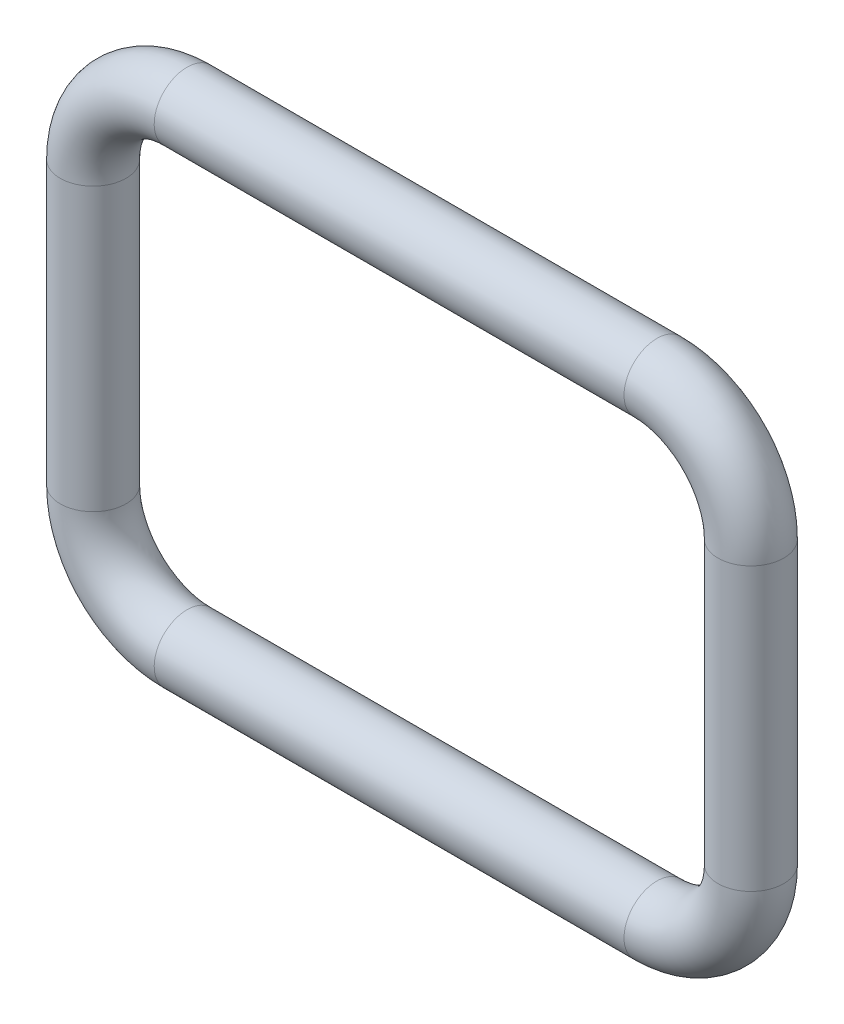
ISO-10303-21;
HEADER;
FILE_DESCRIPTION(('STEP AP214'),'2;1');
FILE_NAME('part.step','',(''),(''),'','','');
FILE_SCHEMA(('AUTOMOTIVE_DESIGN { 1 0 10303 214 1 1 1 1 }'));
ENDSEC;
DATA;
#1=APPLICATION_CONTEXT('core data for automotive mechanical design processes');
#2=APPLICATION_PROTOCOL_DEFINITION('international standard','automotive_design',2000,#1);
#3=PRODUCT_CONTEXT('',#1,'mechanical');
#4=PRODUCT('Part','Part','',(#3));
#5=PRODUCT_RELATED_PRODUCT_CATEGORY('part','',(#4));
#6=PRODUCT_DEFINITION_FORMATION('','',#4);
#7=PRODUCT_DEFINITION_CONTEXT('part definition',#1,'design');
#8=PRODUCT_DEFINITION('design','',#6,#7);
#9=PRODUCT_DEFINITION_SHAPE('','',#8);
#10=(LENGTH_UNIT() NAMED_UNIT(*) SI_UNIT(.MILLI.,.METRE.));
#11=(NAMED_UNIT(*) PLANE_ANGLE_UNIT() SI_UNIT($,.RADIAN.));
#12=(NAMED_UNIT(*) SI_UNIT($,.STERADIAN.) SOLID_ANGLE_UNIT());
#13=UNCERTAINTY_MEASURE_WITH_UNIT(LENGTH_MEASURE(1.E-05),#10,'distance_accuracy_value','');
#14=(GEOMETRIC_REPRESENTATION_CONTEXT(3) GLOBAL_UNCERTAINTY_ASSIGNED_CONTEXT((#13)) GLOBAL_UNIT_ASSIGNED_CONTEXT((#10,
#11,#12)) REPRESENTATION_CONTEXT('',''));
#15=CARTESIAN_POINT('',(0.,0.,0.));
#16=DIRECTION('',(0.,0.,1.));
#17=DIRECTION('',(1.,0.,0.));
#18=AXIS2_PLACEMENT_3D('',#15,#16,#17);
#19=CARTESIAN_POINT('',(-2.61538461538461,1.,0.));
#20=DIRECTION('',(0.,0.,-1.));
#21=DIRECTION('',(-1.,0.,0.));
#22=AXIS2_PLACEMENT_3D('',#19,#20,#21);
#23=TOROIDAL_SURFACE('',#22,1.,0.35);
#24=CARTESIAN_POINT('',(-2.6153846153846,0.,0.));
#25=DIRECTION('',(1.,0.,0.));
#26=DIRECTION('',(0.,1.,0.));
#27=AXIS2_PLACEMENT_3D('',#24,#25,#26);
#28=CIRCLE('',#27,0.35);
#29=CARTESIAN_POINT('',(-2.6153846153846,-0.35,0.));
#30=VERTEX_POINT('',#29);
#31=EDGE_CURVE('E76',#30,#30,#28,.T.);
#32=CARTESIAN_POINT('',(-3.61538461538461,1.00000000000001,0.));
#33=DIRECTION('',(0.,-1.,0.));
#34=DIRECTION('',(1.,0.,0.));
#35=AXIS2_PLACEMENT_3D('',#32,#33,#34);
#36=CIRCLE('',#35,0.35);
#37=CARTESIAN_POINT('',(-3.96538461538461,1.00000000000001,0.));
#38=VERTEX_POINT('',#37);
#39=EDGE_CURVE('E73',#38,#38,#36,.T.);
#40=CARTESIAN_POINT('',(-2.61538461538461,1.,0.));
#41=DIRECTION('',(0.,0.,-1.));
#42=DIRECTION('',(-1.,0.,0.));
#43=AXIS2_PLACEMENT_3D('',#40,#41,#42);
#44=CIRCLE('',#43,1.35);
#45=EDGE_CURVE('',#30,#38,#44,.T.);
#46=ORIENTED_EDGE('',*,*,#31,.F.);
#47=ORIENTED_EDGE('',*,*,#39,.T.);
#48=ORIENTED_EDGE('',*,*,#45,.T.);
#49=ORIENTED_EDGE('',*,*,#45,.F.);
#50=EDGE_LOOP('',(#46,#48,#47,#49));
#51=FACE_BOUND('',#50,.T.);
#52=ADVANCED_FACE('F47',(#51),#23,.T.);
#53=CARTESIAN_POINT('',(-3.61538461538461,1.00000000000001,0.));
#54=DIRECTION('',(0.,1.,0.));
#55=DIRECTION('',(0.,0.,1.));
#56=AXIS2_PLACEMENT_3D('',#53,#54,#55);
#57=CYLINDRICAL_SURFACE('',#56,0.35);
#58=CARTESIAN_POINT('',(-3.61538461538461,3.99999999999999,0.));
#59=DIRECTION('',(0.,-1.,0.));
#60=DIRECTION('',(1.,0.,0.));
#61=AXIS2_PLACEMENT_3D('',#58,#59,#60);
#62=CIRCLE('',#61,0.35);
#63=CARTESIAN_POINT('',(-3.96538461538461,3.99999999999999,0.));
#64=VERTEX_POINT('',#63);
#65=EDGE_CURVE('E70',#64,#64,#62,.T.);
#66=ORIENTED_EDGE('',*,*,#65,.T.);
#67=EDGE_LOOP('',(#66));
#68=FACE_BOUND('',#67,.T.);
#69=ORIENTED_EDGE('',*,*,#39,.F.);
#70=EDGE_LOOP('',(#69));
#71=FACE_BOUND('',#70,.T.);
#72=ADVANCED_FACE('F83',(#68,#71),#57,.T.);
#73=CARTESIAN_POINT('',(-2.61538461538461,4.,0.));
#74=DIRECTION('',(0.,0.,-1.));
#75=DIRECTION('',(-1.,0.,0.));
#76=AXIS2_PLACEMENT_3D('',#73,#74,#75);
#77=TOROIDAL_SURFACE('',#76,1.,0.35);
#78=CARTESIAN_POINT('',(-2.6153846153846,5.,0.));
#79=DIRECTION('',(-1.,0.,0.));
#80=DIRECTION('',(0.,-1.,0.));
#81=AXIS2_PLACEMENT_3D('',#78,#79,#80);
#82=CIRCLE('',#81,0.35);
#83=CARTESIAN_POINT('',(-2.6153846153846,5.35,0.));
#84=VERTEX_POINT('',#83);
#85=EDGE_CURVE('E67',#84,#84,#82,.T.);
#86=CARTESIAN_POINT('',(-2.61538461538461,4.,0.));
#87=DIRECTION('',(0.,0.,-1.));
#88=DIRECTION('',(-1.,0.,0.));
#89=AXIS2_PLACEMENT_3D('',#86,#87,#88);
#90=CIRCLE('',#89,1.35);
#91=EDGE_CURVE('',#64,#84,#90,.T.);
#92=ORIENTED_EDGE('',*,*,#65,.F.);
#93=ORIENTED_EDGE('',*,*,#85,.T.);
#94=ORIENTED_EDGE('',*,*,#91,.T.);
#95=ORIENTED_EDGE('',*,*,#91,.F.);
#96=EDGE_LOOP('',(#92,#94,#93,#95));
#97=FACE_BOUND('',#96,.T.);
#98=ADVANCED_FACE('F89',(#97),#77,.T.);
#99=CARTESIAN_POINT('',(-2.6153846153846,5.,0.));
#100=DIRECTION('',(1.,0.,0.));
#101=DIRECTION('',(0.,0.,-1.));
#102=AXIS2_PLACEMENT_3D('',#99,#100,#101);
#103=CYLINDRICAL_SURFACE('',#102,0.35);
#104=CARTESIAN_POINT('',(2.38461538461538,5.,0.));
#105=DIRECTION('',(-1.,0.,0.));
#106=DIRECTION('',(0.,-1.,0.));
#107=AXIS2_PLACEMENT_3D('',#104,#105,#106);
#108=CIRCLE('',#107,0.35);
#109=CARTESIAN_POINT('',(2.38461538461538,5.35,0.));
#110=VERTEX_POINT('',#109);
#111=EDGE_CURVE('E62',#110,#110,#108,.T.);
#112=ORIENTED_EDGE('',*,*,#111,.T.);
#113=EDGE_LOOP('',(#112));
#114=FACE_BOUND('',#113,.T.);
#115=ORIENTED_EDGE('',*,*,#85,.F.);
#116=EDGE_LOOP('',(#115));
#117=FACE_BOUND('',#116,.T.);
#118=ADVANCED_FACE('F95',(#114,#117),#103,.T.);
#119=CARTESIAN_POINT('',(2.38461538461539,4.,0.));
#120=DIRECTION('',(0.,0.,-1.));
#121=DIRECTION('',(-1.,0.,0.));
#122=AXIS2_PLACEMENT_3D('',#119,#120,#121);
#123=TOROIDAL_SURFACE('',#122,1.,0.35);
#124=CARTESIAN_POINT('',(3.38461538461539,4.,0.));
#125=DIRECTION('',(0.,1.,0.));
#126=DIRECTION('',(-1.,0.,0.));
#127=AXIS2_PLACEMENT_3D('',#124,#125,#126);
#128=CIRCLE('',#127,0.35);
#129=CARTESIAN_POINT('',(3.73461538461539,4.,0.));
#130=VERTEX_POINT('',#129);
#131=EDGE_CURVE('E58',#130,#130,#128,.T.);
#132=CARTESIAN_POINT('',(2.38461538461539,4.,0.));
#133=DIRECTION('',(0.,0.,-1.));
#134=DIRECTION('',(-1.,0.,0.));
#135=AXIS2_PLACEMENT_3D('',#132,#133,#134);
#136=CIRCLE('',#135,1.35);
#137=EDGE_CURVE('',#110,#130,#136,.T.);
#138=ORIENTED_EDGE('',*,*,#111,.F.);
#139=ORIENTED_EDGE('',*,*,#131,.T.);
#140=ORIENTED_EDGE('',*,*,#137,.T.);
#141=ORIENTED_EDGE('',*,*,#137,.F.);
#142=EDGE_LOOP('',(#138,#140,#139,#141));
#143=FACE_BOUND('',#142,.T.);
#144=ADVANCED_FACE('F99',(#143),#123,.T.);
#145=CARTESIAN_POINT('',(3.38461538461539,3.99999999999999,0.));
#146=DIRECTION('',(0.,-1.,0.));
#147=DIRECTION('',(0.,0.,-1.));
#148=AXIS2_PLACEMENT_3D('',#145,#146,#147);
#149=CYLINDRICAL_SURFACE('',#148,0.35);
#150=CARTESIAN_POINT('',(3.38461538461539,1.00000000000001,0.));
#151=DIRECTION('',(0.,1.,0.));
#152=DIRECTION('',(-1.,0.,0.));
#153=AXIS2_PLACEMENT_3D('',#150,#151,#152);
#154=CIRCLE('',#153,0.35);
#155=CARTESIAN_POINT('',(3.73461538461539,1.00000000000001,0.));
#156=VERTEX_POINT('',#155);
#157=EDGE_CURVE('E54',#156,#156,#154,.T.);
#158=ORIENTED_EDGE('',*,*,#157,.T.);
#159=EDGE_LOOP('',(#158));
#160=FACE_BOUND('',#159,.T.);
#161=ORIENTED_EDGE('',*,*,#131,.F.);
#162=EDGE_LOOP('',(#161));
#163=FACE_BOUND('',#162,.T.);
#164=ADVANCED_FACE('F103',(#160,#163),#149,.T.);
#165=CARTESIAN_POINT('',(2.38461538461539,1.,0.));
#166=DIRECTION('',(0.,0.,-1.));
#167=DIRECTION('',(-1.,0.,0.));
#168=AXIS2_PLACEMENT_3D('',#165,#166,#167);
#169=TOROIDAL_SURFACE('',#168,1.,0.35);
#170=CARTESIAN_POINT('',(2.38461538461538,0.,0.));
#171=DIRECTION('',(1.,0.,0.));
#172=DIRECTION('',(0.,1.,0.));
#173=AXIS2_PLACEMENT_3D('',#170,#171,#172);
#174=CIRCLE('',#173,0.35);
#175=CARTESIAN_POINT('',(2.38461538461538,-0.35,0.));
#176=VERTEX_POINT('',#175);
#177=EDGE_CURVE('E11',#176,#176,#174,.T.);
#178=CARTESIAN_POINT('',(2.38461538461539,1.,0.));
#179=DIRECTION('',(0.,0.,-1.));
#180=DIRECTION('',(-1.,0.,0.));
#181=AXIS2_PLACEMENT_3D('',#178,#179,#180);
#182=CIRCLE('',#181,1.35);
#183=EDGE_CURVE('',#156,#176,#182,.T.);
#184=ORIENTED_EDGE('',*,*,#157,.F.);
#185=ORIENTED_EDGE('',*,*,#177,.T.);
#186=ORIENTED_EDGE('',*,*,#183,.T.);
#187=ORIENTED_EDGE('',*,*,#183,.F.);
#188=EDGE_LOOP('',(#184,#186,#185,#187));
#189=FACE_BOUND('',#188,.T.);
#190=ADVANCED_FACE('F106',(#189),#169,.T.);
#191=CARTESIAN_POINT('',(2.38461538461538,0.,0.));
#192=DIRECTION('',(-1.,0.,0.));
#193=DIRECTION('',(0.,0.,1.));
#194=AXIS2_PLACEMENT_3D('',#191,#192,#193);
#195=CYLINDRICAL_SURFACE('',#194,0.35);
#196=ORIENTED_EDGE('',*,*,#31,.T.);
#197=EDGE_LOOP('',(#196));
#198=FACE_BOUND('',#197,.T.);
#199=ORIENTED_EDGE('',*,*,#177,.F.);
#200=EDGE_LOOP('',(#199));
#201=FACE_BOUND('',#200,.T.);
#202=ADVANCED_FACE('F49',(#198,#201),#195,.T.);
#203=CLOSED_SHELL('',(#52,#72,#98,#118,#144,#164,#190,#202));
#204=MANIFOLD_SOLID_BREP('B2',#203);
#205=ADVANCED_BREP_SHAPE_REPRESENTATION('',(#18,#204),#14);
#206=SHAPE_DEFINITION_REPRESENTATION(#9,#205);
ENDSEC;
END-ISO-10303-21;
